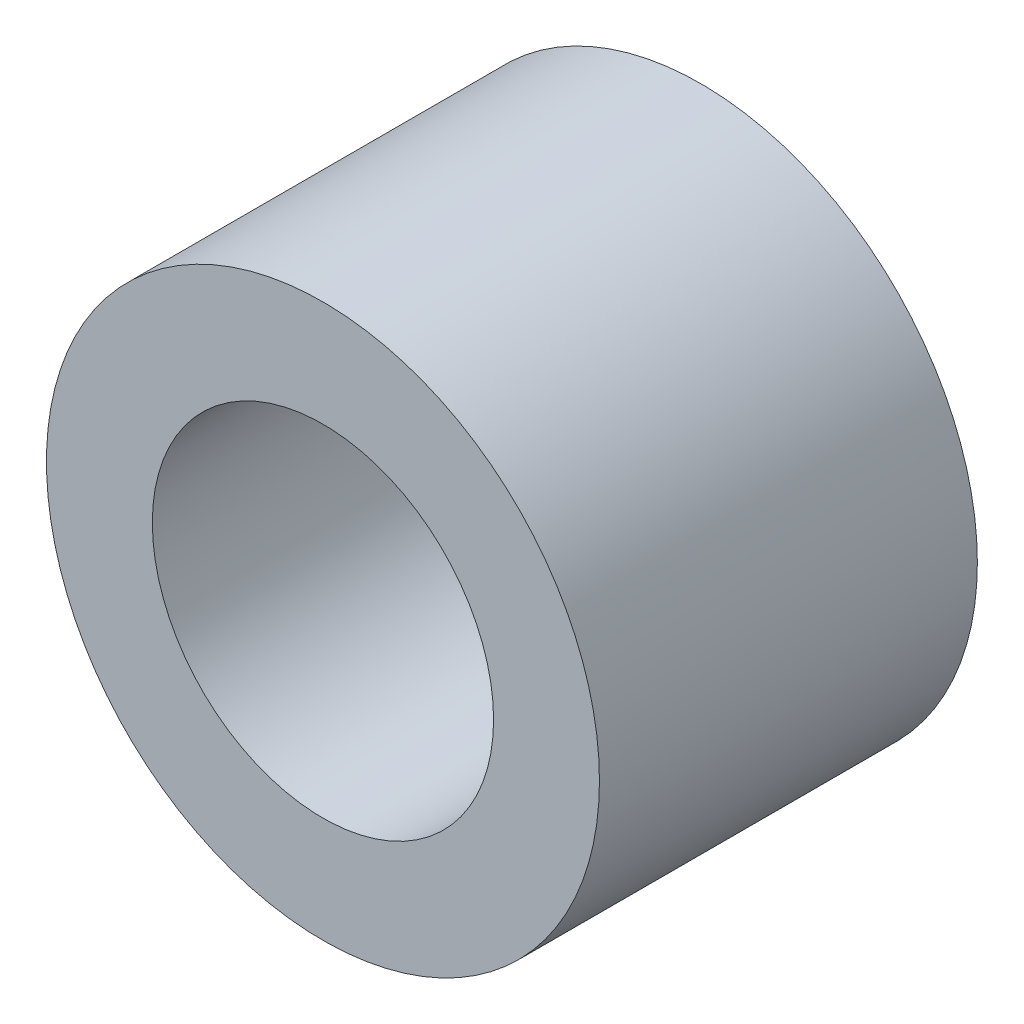
ISO-10303-21;
HEADER;
FILE_DESCRIPTION(('STEP AP214'),'2;1');
FILE_NAME('part.step','',(''),(''),'','','');
FILE_SCHEMA(('AUTOMOTIVE_DESIGN { 1 0 10303 214 1 1 1 1 }'));
ENDSEC;
DATA;
#1=APPLICATION_CONTEXT('core data for automotive mechanical design processes');
#2=APPLICATION_PROTOCOL_DEFINITION('international standard','automotive_design',2000,#1);
#3=PRODUCT_CONTEXT('',#1,'mechanical');
#4=PRODUCT('Part','Part','',(#3));
#5=PRODUCT_RELATED_PRODUCT_CATEGORY('part','',(#4));
#6=PRODUCT_DEFINITION_FORMATION('','',#4);
#7=PRODUCT_DEFINITION_CONTEXT('part definition',#1,'design');
#8=PRODUCT_DEFINITION('design','',#6,#7);
#9=PRODUCT_DEFINITION_SHAPE('','',#8);
#10=(LENGTH_UNIT() NAMED_UNIT(*) SI_UNIT(.MILLI.,.METRE.));
#11=(NAMED_UNIT(*) PLANE_ANGLE_UNIT() SI_UNIT($,.RADIAN.));
#12=(NAMED_UNIT(*) SI_UNIT($,.STERADIAN.) SOLID_ANGLE_UNIT());
#13=UNCERTAINTY_MEASURE_WITH_UNIT(LENGTH_MEASURE(1.E-05),#10,'distance_accuracy_value','');
#14=(GEOMETRIC_REPRESENTATION_CONTEXT(3) GLOBAL_UNCERTAINTY_ASSIGNED_CONTEXT((#13)) GLOBAL_UNIT_ASSIGNED_CONTEXT((#10,
#11,#12)) REPRESENTATION_CONTEXT('',''));
#15=CARTESIAN_POINT('',(0.,0.,0.));
#16=DIRECTION('',(0.,0.,1.));
#17=DIRECTION('',(1.,0.,0.));
#18=AXIS2_PLACEMENT_3D('',#15,#16,#17);
#19=CARTESIAN_POINT('',(0.,0.,27.686));
#20=DIRECTION('',(0.,0.,1.));
#21=DIRECTION('',(1.,0.,0.));
#22=AXIS2_PLACEMENT_3D('',#19,#20,#21);
#23=PLANE('',#22);
#24=CARTESIAN_POINT('',(0.,0.,27.686));
#25=DIRECTION('',(0.,0.,1.));
#26=DIRECTION('',(1.,0.,0.));
#27=AXIS2_PLACEMENT_3D('',#24,#25,#26);
#28=CIRCLE('',#27,20.2565);
#29=CARTESIAN_POINT('',(20.2565,0.,27.686));
#30=VERTEX_POINT('',#29);
#31=EDGE_CURVE('E53',#30,#30,#28,.T.);
#32=ORIENTED_EDGE('',*,*,#31,.T.);
#33=EDGE_LOOP('',(#32));
#34=FACE_BOUND('',#33,.T.);
#35=CARTESIAN_POINT('',(0.,0.,27.686));
#36=DIRECTION('',(0.,0.,1.));
#37=DIRECTION('',(1.,0.,0.));
#38=AXIS2_PLACEMENT_3D('',#35,#36,#37);
#39=CIRCLE('',#38,12.499975);
#40=CARTESIAN_POINT('',(12.499975,0.,27.686));
#41=VERTEX_POINT('',#40);
#42=EDGE_CURVE('E64',#41,#41,#39,.T.);
#43=ORIENTED_EDGE('',*,*,#42,.F.);
#44=EDGE_LOOP('',(#43));
#45=FACE_BOUND('',#44,.T.);
#46=ADVANCED_FACE('F44',(#34,#45),#23,.T.);
#47=CARTESIAN_POINT('',(0.,0.,0.));
#48=DIRECTION('',(0.,0.,1.));
#49=DIRECTION('',(1.,0.,0.));
#50=AXIS2_PLACEMENT_3D('',#47,#48,#49);
#51=PLANE('',#50);
#52=CARTESIAN_POINT('',(0.,0.,0.));
#53=DIRECTION('',(0.,0.,1.));
#54=DIRECTION('',(1.,0.,0.));
#55=AXIS2_PLACEMENT_3D('',#52,#53,#54);
#56=CIRCLE('',#55,20.2565);
#57=CARTESIAN_POINT('',(20.2565,0.,0.));
#58=VERTEX_POINT('',#57);
#59=EDGE_CURVE('E58',#58,#58,#56,.T.);
#60=ORIENTED_EDGE('',*,*,#59,.F.);
#61=EDGE_LOOP('',(#60));
#62=FACE_BOUND('',#61,.T.);
#63=ADVANCED_FACE('F115',(#62),#51,.F.);
#64=CARTESIAN_POINT('',(0.,0.,27.686));
#65=DIRECTION('',(0.,0.,-1.));
#66=DIRECTION('',(-1.,0.,0.));
#67=AXIS2_PLACEMENT_3D('',#64,#65,#66);
#68=CYLINDRICAL_SURFACE('',#67,20.2565);
#69=ORIENTED_EDGE('',*,*,#31,.F.);
#70=EDGE_LOOP('',(#69));
#71=FACE_BOUND('',#70,.T.);
#72=ORIENTED_EDGE('',*,*,#59,.T.);
#73=EDGE_LOOP('',(#72));
#74=FACE_BOUND('',#73,.T.);
#75=ADVANCED_FACE('F46',(#71,#74),#68,.T.);
#76=CARTESIAN_POINT('',(0.,0.,0.254));
#77=DIRECTION('',(0.,0.,-1.));
#78=DIRECTION('',(-1.,0.,0.));
#79=AXIS2_PLACEMENT_3D('',#76,#77,#78);
#80=PLANE('',#79);
#81=CARTESIAN_POINT('',(0.,0.,0.254));
#82=DIRECTION('',(0.,0.,-1.));
#83=DIRECTION('',(-1.,0.,0.));
#84=AXIS2_PLACEMENT_3D('',#81,#82,#83);
#85=CIRCLE('',#84,12.499975);
#86=CARTESIAN_POINT('',(-12.499975,0.,0.254));
#87=VERTEX_POINT('',#86);
#88=EDGE_CURVE('E74',#87,#87,#85,.T.);
#89=ORIENTED_EDGE('',*,*,#88,.F.);
#90=EDGE_LOOP('',(#89));
#91=FACE_BOUND('',#90,.T.);
#92=ADVANCED_FACE('F100',(#91),#80,.F.);
#93=CARTESIAN_POINT('',(0.,0.,27.686));
#94=DIRECTION('',(0.,0.,-1.));
#95=DIRECTION('',(-1.,0.,0.));
#96=AXIS2_PLACEMENT_3D('',#93,#94,#95);
#97=CYLINDRICAL_SURFACE('',#96,12.499975);
#98=ORIENTED_EDGE('',*,*,#42,.T.);
#99=EDGE_LOOP('',(#98));
#100=FACE_BOUND('',#99,.T.);
#101=ORIENTED_EDGE('',*,*,#88,.T.);
#102=EDGE_LOOP('',(#101));
#103=FACE_BOUND('',#102,.T.);
#104=ADVANCED_FACE('F103',(#100,#103),#97,.F.);
#105=CLOSED_SHELL('',(#46,#63,#75,#92,#104));
#106=CARTESIAN_POINT('',(0.,0.,27.432));
#107=DIRECTION('',(0.,0.,1.));
#108=DIRECTION('',(1.,0.,0.));
#109=AXIS2_PLACEMENT_3D('',#106,#107,#108);
#110=PLANE('',#109);
#111=CARTESIAN_POINT('',(0.,0.,27.432));
#112=DIRECTION('',(0.,0.,1.));
#113=DIRECTION('',(1.,0.,0.));
#114=AXIS2_PLACEMENT_3D('',#111,#112,#113);
#115=CIRCLE('',#114,12.753975);
#116=CARTESIAN_POINT('',(12.753975,0.,27.432));
#117=VERTEX_POINT('',#116);
#118=EDGE_CURVE('E10',#117,#117,#115,.T.);
#119=ORIENTED_EDGE('',*,*,#118,.T.);
#120=EDGE_LOOP('',(#119));
#121=FACE_BOUND('',#120,.T.);
#122=CARTESIAN_POINT('',(0.,0.,27.432));
#123=DIRECTION('',(0.,0.,1.));
#124=DIRECTION('',(1.,0.,0.));
#125=AXIS2_PLACEMENT_3D('',#122,#123,#124);
#126=CIRCLE('',#125,20.0025);
#127=CARTESIAN_POINT('',(20.0025,0.,27.432));
#128=VERTEX_POINT('',#127);
#129=EDGE_CURVE('E81',#128,#128,#126,.T.);
#130=ORIENTED_EDGE('',*,*,#129,.F.);
#131=EDGE_LOOP('',(#130));
#132=FACE_BOUND('',#131,.T.);
#133=ADVANCED_FACE('F88',(#121,#132),#110,.F.);
#134=CARTESIAN_POINT('',(0.,0.,27.686));
#135=DIRECTION('',(0.,0.,-1.));
#136=DIRECTION('',(-1.,0.,0.));
#137=AXIS2_PLACEMENT_3D('',#134,#135,#136);
#138=CYLINDRICAL_SURFACE('',#137,20.0025);
#139=CARTESIAN_POINT('',(0.,0.,0.254000000000001));
#140=DIRECTION('',(0.,0.,1.));
#141=DIRECTION('',(1.,0.,0.));
#142=AXIS2_PLACEMENT_3D('',#139,#140,#141);
#143=CIRCLE('',#142,20.0025);
#144=CARTESIAN_POINT('',(20.0025,0.,0.254000000000001));
#145=VERTEX_POINT('',#144);
#146=EDGE_CURVE('E69',#145,#145,#143,.T.);
#147=ORIENTED_EDGE('',*,*,#146,.F.);
#148=EDGE_LOOP('',(#147));
#149=FACE_BOUND('',#148,.T.);
#150=ORIENTED_EDGE('',*,*,#129,.T.);
#151=EDGE_LOOP('',(#150));
#152=FACE_BOUND('',#151,.T.);
#153=ADVANCED_FACE('F86',(#149,#152),#138,.F.);
#154=CARTESIAN_POINT('',(0.,0.,0.254));
#155=DIRECTION('',(0.,0.,1.));
#156=DIRECTION('',(1.,0.,0.));
#157=AXIS2_PLACEMENT_3D('',#154,#155,#156);
#158=PLANE('',#157);
#159=ORIENTED_EDGE('',*,*,#146,.T.);
#160=EDGE_LOOP('',(#159));
#161=FACE_BOUND('',#160,.T.);
#162=CARTESIAN_POINT('',(0.,0.,0.254000000000001));
#163=DIRECTION('',(0.,0.,1.));
#164=DIRECTION('',(1.,0.,0.));
#165=AXIS2_PLACEMENT_3D('',#162,#163,#164);
#166=CIRCLE('',#165,12.753975);
#167=CARTESIAN_POINT('',(12.753975,0.,0.254000000000001));
#168=VERTEX_POINT('',#167);
#169=EDGE_CURVE('E70',#168,#168,#166,.T.);
#170=ORIENTED_EDGE('',*,*,#169,.F.);
#171=EDGE_LOOP('',(#170));
#172=FACE_BOUND('',#171,.T.);
#173=ADVANCED_FACE('F96',(#161,#172),#158,.T.);
#174=CARTESIAN_POINT('',(0.,0.,27.686));
#175=DIRECTION('',(0.,0.,-1.));
#176=DIRECTION('',(-1.,0.,0.));
#177=AXIS2_PLACEMENT_3D('',#174,#175,#176);
#178=CYLINDRICAL_SURFACE('',#177,12.753975);
#179=ORIENTED_EDGE('',*,*,#169,.T.);
#180=EDGE_LOOP('',(#179));
#181=FACE_BOUND('',#180,.T.);
#182=ORIENTED_EDGE('',*,*,#118,.F.);
#183=EDGE_LOOP('',(#182));
#184=FACE_BOUND('',#183,.T.);
#185=ADVANCED_FACE('F106',(#181,#184),#178,.T.);
#186=CLOSED_SHELL('',(#133,#153,#173,#185));
#187=ORIENTED_CLOSED_SHELL('',*,#186,.T.);
#188=BREP_WITH_VOIDS('B2',#105,(#187));
#189=ADVANCED_BREP_SHAPE_REPRESENTATION('',(#18,#188),#14);
#190=SHAPE_DEFINITION_REPRESENTATION(#9,#189);
ENDSEC;
END-ISO-10303-21;
